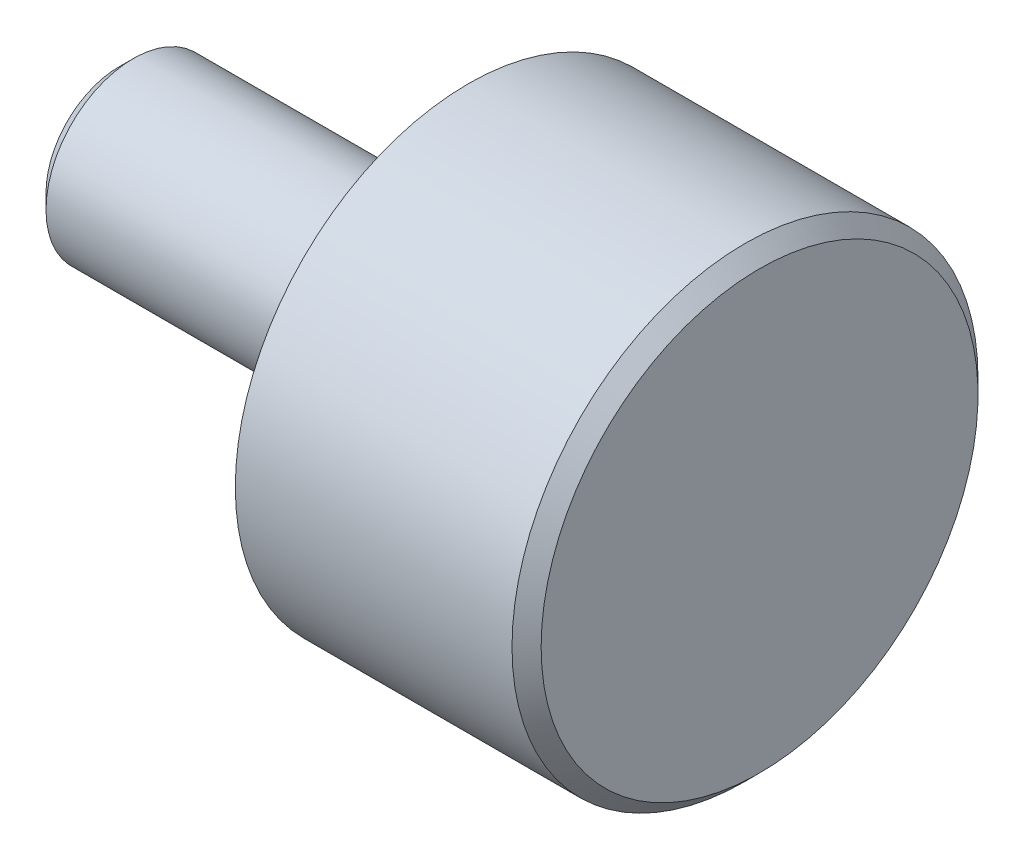
ISO-10303-21;
HEADER;
FILE_DESCRIPTION(('STEP AP214'),'2;1');
FILE_NAME('part.step','',(''),(''),'','','');
FILE_SCHEMA(('AUTOMOTIVE_DESIGN { 1 0 10303 214 1 1 1 1 }'));
ENDSEC;
DATA;
#1=APPLICATION_CONTEXT('core data for automotive mechanical design processes');
#2=APPLICATION_PROTOCOL_DEFINITION('international standard','automotive_design',2000,#1);
#3=PRODUCT_CONTEXT('',#1,'mechanical');
#4=PRODUCT('Part','Part','',(#3));
#5=PRODUCT_RELATED_PRODUCT_CATEGORY('part','',(#4));
#6=PRODUCT_DEFINITION_FORMATION('','',#4);
#7=PRODUCT_DEFINITION_CONTEXT('part definition',#1,'design');
#8=PRODUCT_DEFINITION('design','',#6,#7);
#9=PRODUCT_DEFINITION_SHAPE('','',#8);
#10=(LENGTH_UNIT() NAMED_UNIT(*) SI_UNIT(.MILLI.,.METRE.));
#11=(NAMED_UNIT(*) PLANE_ANGLE_UNIT() SI_UNIT($,.RADIAN.));
#12=(NAMED_UNIT(*) SI_UNIT($,.STERADIAN.) SOLID_ANGLE_UNIT());
#13=UNCERTAINTY_MEASURE_WITH_UNIT(LENGTH_MEASURE(1.E-05),#10,'distance_accuracy_value','');
#14=(GEOMETRIC_REPRESENTATION_CONTEXT(3) GLOBAL_UNCERTAINTY_ASSIGNED_CONTEXT((#13)) GLOBAL_UNIT_ASSIGNED_CONTEXT((#10,
#11,#12)) REPRESENTATION_CONTEXT('',''));
#15=CARTESIAN_POINT('',(0.,0.,0.));
#16=DIRECTION('',(0.,0.,1.));
#17=DIRECTION('',(1.,0.,0.));
#18=AXIS2_PLACEMENT_3D('',#15,#16,#17);
#19=CARTESIAN_POINT('',(-12.,0.,0.));
#20=DIRECTION('',(1.,0.,0.));
#21=DIRECTION('',(0.,0.,-1.));
#22=AXIS2_PLACEMENT_3D('',#19,#20,#21);
#23=PLANE('',#22);
#24=CARTESIAN_POINT('',(-12.,0.,0.));
#25=DIRECTION('',(-1.,0.,0.));
#26=DIRECTION('',(0.,0.,1.));
#27=AXIS2_PLACEMENT_3D('',#24,#25,#26);
#28=CIRCLE('',#27,2.5);
#29=CARTESIAN_POINT('',(-12.,0.,2.5));
#30=VERTEX_POINT('',#29);
#31=EDGE_CURVE('E10',#30,#30,#28,.T.);
#32=ORIENTED_EDGE('',*,*,#31,.T.);
#33=EDGE_LOOP('',(#32));
#34=FACE_BOUND('',#33,.T.);
#35=ADVANCED_FACE('F37',(#34),#23,.F.);
#36=CARTESIAN_POINT('',(-11.5,0.,0.));
#37=DIRECTION('',(1.,0.,0.));
#38=DIRECTION('',(0.,0.,-1.));
#39=AXIS2_PLACEMENT_3D('',#36,#37,#38);
#40=CONICAL_SURFACE('',#39,3.,0.785398163397448);
#41=ORIENTED_EDGE('',*,*,#31,.F.);
#42=EDGE_LOOP('',(#41));
#43=FACE_BOUND('',#42,.T.);
#44=CARTESIAN_POINT('',(-11.5,0.,0.));
#45=DIRECTION('',(-1.,0.,0.));
#46=DIRECTION('',(0.,0.,1.));
#47=AXIS2_PLACEMENT_3D('',#44,#45,#46);
#48=CIRCLE('',#47,3.);
#49=CARTESIAN_POINT('',(-11.5,0.,3.));
#50=VERTEX_POINT('',#49);
#51=EDGE_CURVE('E43',#50,#50,#48,.T.);
#52=ORIENTED_EDGE('',*,*,#51,.T.);
#53=EDGE_LOOP('',(#52));
#54=FACE_BOUND('',#53,.T.);
#55=ADVANCED_FACE('F75',(#43,#54),#40,.T.);
#56=CARTESIAN_POINT('',(-15.,0.,0.));
#57=DIRECTION('',(-1.,0.,0.));
#58=DIRECTION('',(0.,0.,1.));
#59=AXIS2_PLACEMENT_3D('',#56,#57,#58);
#60=CYLINDRICAL_SURFACE('',#59,3.);
#61=ORIENTED_EDGE('',*,*,#51,.F.);
#62=EDGE_LOOP('',(#61));
#63=FACE_BOUND('',#62,.T.);
#64=CARTESIAN_POINT('',(0.,0.,0.));
#65=DIRECTION('',(-1.,0.,0.));
#66=DIRECTION('',(0.,0.,1.));
#67=AXIS2_PLACEMENT_3D('',#64,#65,#66);
#68=CIRCLE('',#67,3.);
#69=CARTESIAN_POINT('',(0.,0.,3.));
#70=VERTEX_POINT('',#69);
#71=EDGE_CURVE('E47',#70,#70,#68,.T.);
#72=ORIENTED_EDGE('',*,*,#71,.T.);
#73=EDGE_LOOP('',(#72));
#74=FACE_BOUND('',#73,.T.);
#75=ADVANCED_FACE('F79',(#63,#74),#60,.T.);
#76=CARTESIAN_POINT('',(0.,3.,0.));
#77=DIRECTION('',(1.,0.,0.));
#78=DIRECTION('',(0.,0.,-1.));
#79=AXIS2_PLACEMENT_3D('',#76,#77,#78);
#80=PLANE('',#79);
#81=ORIENTED_EDGE('',*,*,#71,.F.);
#82=EDGE_LOOP('',(#81));
#83=FACE_BOUND('',#82,.T.);
#84=CARTESIAN_POINT('',(0.,0.,0.));
#85=DIRECTION('',(-1.,0.,0.));
#86=DIRECTION('',(0.,0.,1.));
#87=AXIS2_PLACEMENT_3D('',#84,#85,#86);
#88=CIRCLE('',#87,8.);
#89=CARTESIAN_POINT('',(0.,0.,8.));
#90=VERTEX_POINT('',#89);
#91=EDGE_CURVE('E51',#90,#90,#88,.T.);
#92=ORIENTED_EDGE('',*,*,#91,.T.);
#93=EDGE_LOOP('',(#92));
#94=FACE_BOUND('',#93,.T.);
#95=ADVANCED_FACE('F84',(#83,#94),#80,.F.);
#96=CARTESIAN_POINT('',(-15.,0.,0.));
#97=DIRECTION('',(-1.,0.,0.));
#98=DIRECTION('',(0.,0.,1.));
#99=AXIS2_PLACEMENT_3D('',#96,#97,#98);
#100=CYLINDRICAL_SURFACE('',#99,8.);
#101=ORIENTED_EDGE('',*,*,#91,.F.);
#102=EDGE_LOOP('',(#101));
#103=FACE_BOUND('',#102,.T.);
#104=CARTESIAN_POINT('',(9.5,0.,0.));
#105=DIRECTION('',(-1.,0.,0.));
#106=DIRECTION('',(0.,0.,1.));
#107=AXIS2_PLACEMENT_3D('',#104,#105,#106);
#108=CIRCLE('',#107,8.);
#109=CARTESIAN_POINT('',(9.5,0.,8.));
#110=VERTEX_POINT('',#109);
#111=EDGE_CURVE('E56',#110,#110,#108,.T.);
#112=ORIENTED_EDGE('',*,*,#111,.T.);
#113=EDGE_LOOP('',(#112));
#114=FACE_BOUND('',#113,.T.);
#115=ADVANCED_FACE('F71',(#103,#114),#100,.T.);
#116=CARTESIAN_POINT('',(10.,0.,0.));
#117=DIRECTION('',(-1.,0.,0.));
#118=DIRECTION('',(0.,0.,1.));
#119=AXIS2_PLACEMENT_3D('',#116,#117,#118);
#120=CONICAL_SURFACE('',#119,7.5,0.785398163397448);
#121=ORIENTED_EDGE('',*,*,#111,.F.);
#122=EDGE_LOOP('',(#121));
#123=FACE_BOUND('',#122,.T.);
#124=CARTESIAN_POINT('',(10.,0.,0.));
#125=DIRECTION('',(-1.,0.,0.));
#126=DIRECTION('',(0.,0.,1.));
#127=AXIS2_PLACEMENT_3D('',#124,#125,#126);
#128=CIRCLE('',#127,7.5);
#129=CARTESIAN_POINT('',(10.,0.,7.5));
#130=VERTEX_POINT('',#129);
#131=EDGE_CURVE('E59',#130,#130,#128,.T.);
#132=ORIENTED_EDGE('',*,*,#131,.T.);
#133=EDGE_LOOP('',(#132));
#134=FACE_BOUND('',#133,.T.);
#135=ADVANCED_FACE('F63',(#123,#134),#120,.T.);
#136=CARTESIAN_POINT('',(10.,7.5,0.));
#137=DIRECTION('',(-1.,0.,0.));
#138=DIRECTION('',(0.,0.,1.));
#139=AXIS2_PLACEMENT_3D('',#136,#137,#138);
#140=PLANE('',#139);
#141=ORIENTED_EDGE('',*,*,#131,.F.);
#142=EDGE_LOOP('',(#141));
#143=FACE_BOUND('',#142,.T.);
#144=ADVANCED_FACE('F65',(#143),#140,.F.);
#145=CLOSED_SHELL('',(#35,#55,#75,#95,#115,#135,#144));
#146=MANIFOLD_SOLID_BREP('B2',#145);
#147=ADVANCED_BREP_SHAPE_REPRESENTATION('',(#18,#146),#14);
#148=SHAPE_DEFINITION_REPRESENTATION(#9,#147);
ENDSEC;
END-ISO-10303-21;
